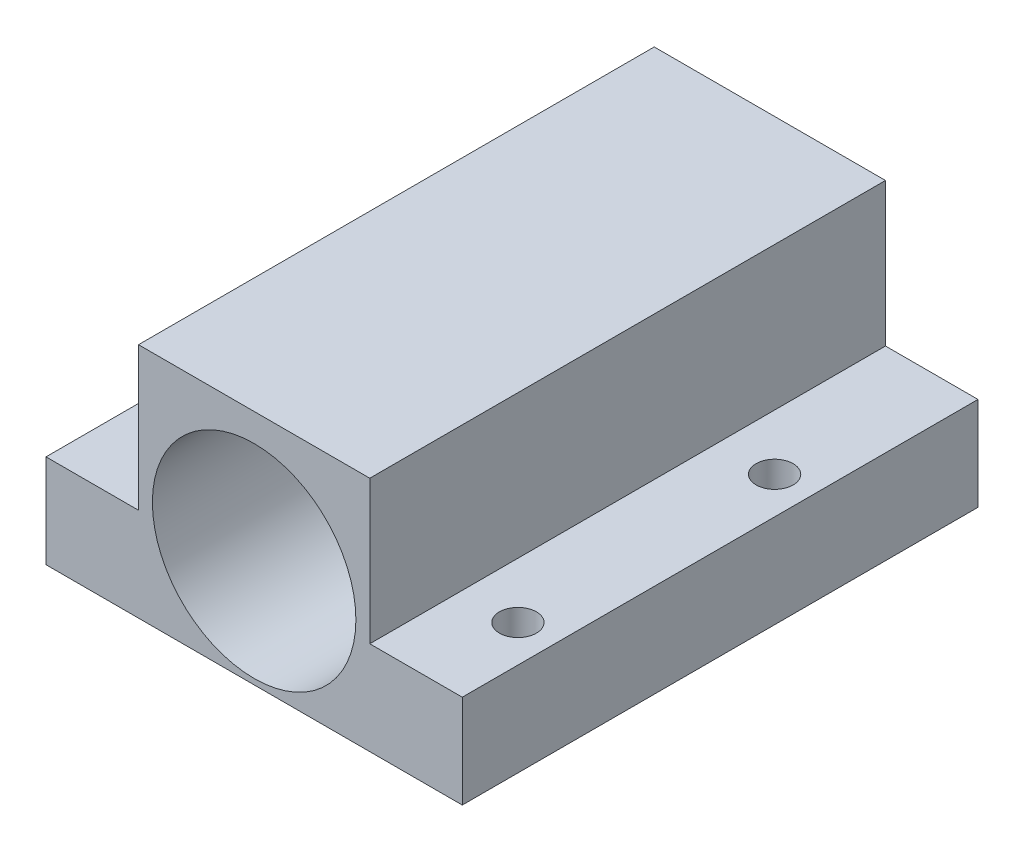
ISO-10303-21;
HEADER;
FILE_DESCRIPTION(('STEP AP214'),'2;1');
FILE_NAME('part.step','',(''),(''),'','','');
FILE_SCHEMA(('AUTOMOTIVE_DESIGN { 1 0 10303 214 1 1 1 1 }'));
ENDSEC;
DATA;
#1=APPLICATION_CONTEXT('core data for automotive mechanical design processes');
#2=APPLICATION_PROTOCOL_DEFINITION('international standard','automotive_design',2000,#1);
#3=PRODUCT_CONTEXT('',#1,'mechanical');
#4=PRODUCT('Part','Part','',(#3));
#5=PRODUCT_RELATED_PRODUCT_CATEGORY('part','',(#4));
#6=PRODUCT_DEFINITION_FORMATION('','',#4);
#7=PRODUCT_DEFINITION_CONTEXT('part definition',#1,'design');
#8=PRODUCT_DEFINITION('design','',#6,#7);
#9=PRODUCT_DEFINITION_SHAPE('','',#8);
#10=(LENGTH_UNIT() NAMED_UNIT(*) SI_UNIT(.MILLI.,.METRE.));
#11=(NAMED_UNIT(*) PLANE_ANGLE_UNIT() SI_UNIT($,.RADIAN.));
#12=(NAMED_UNIT(*) SI_UNIT($,.STERADIAN.) SOLID_ANGLE_UNIT());
#13=UNCERTAINTY_MEASURE_WITH_UNIT(LENGTH_MEASURE(1.E-05),#10,'distance_accuracy_value','');
#14=(GEOMETRIC_REPRESENTATION_CONTEXT(3) GLOBAL_UNCERTAINTY_ASSIGNED_CONTEXT((#13)) GLOBAL_UNIT_ASSIGNED_CONTEXT((#10,
#11,#12)) REPRESENTATION_CONTEXT('',''));
#15=CARTESIAN_POINT('',(0.,0.,0.));
#16=DIRECTION('',(0.,0.,1.));
#17=DIRECTION('',(1.,0.,0.));
#18=AXIS2_PLACEMENT_3D('',#15,#16,#17);
#19=CARTESIAN_POINT('',(-1.01488915650938,-5.09999999999996,-107.522193308764));
#20=DIRECTION('',(0.,0.,1.));
#21=DIRECTION('',(-0.999999999999997,0.,0.));
#22=AXIS2_PLACEMENT_3D('',#19,#20,#21);
#23=CYLINDRICAL_SURFACE('',#22,11.);
#24=CARTESIAN_POINT('',(-1.01488915650944,-5.09999999999996,-1.56125112837913E-13));
#25=DIRECTION('',(0.,0.,1.));
#26=DIRECTION('',(0.999999999999997,0.,0.));
#27=AXIS2_PLACEMENT_3D('',#24,#25,#26);
#28=CIRCLE('',#27,11.);
#29=CARTESIAN_POINT('',(9.98511084349053,-5.09999999999996,-1.56125112837916E-13));
#30=VERTEX_POINT('',#29);
#31=EDGE_CURVE('E146',#30,#30,#28,.T.);
#32=ORIENTED_EDGE('',*,*,#31,.T.);
#33=EDGE_LOOP('',(#32));
#34=FACE_BOUND('',#33,.T.);
#35=CARTESIAN_POINT('',(-1.01488915650938,-5.09999999999992,-55.75));
#36=DIRECTION('',(0.,0.,1.));
#37=DIRECTION('',(0.999999999999997,0.,0.));
#38=AXIS2_PLACEMENT_3D('',#35,#36,#37);
#39=CIRCLE('',#38,11.);
#40=CARTESIAN_POINT('',(9.98511084349059,-5.09999999999992,-55.75));
#41=VERTEX_POINT('',#40);
#42=EDGE_CURVE('E109',#41,#41,#39,.T.);
#43=ORIENTED_EDGE('',*,*,#42,.F.);
#44=EDGE_LOOP('',(#43));
#45=FACE_BOUND('',#44,.T.);
#46=ADVANCED_FACE('F37',(#34,#45),#23,.F.);
#47=CARTESIAN_POINT('',(0.,0.,0.));
#48=DIRECTION('',(0.,0.,-1.));
#49=DIRECTION('',(0.999999999999997,0.,0.));
#50=AXIS2_PLACEMENT_3D('',#47,#48,#49);
#51=PLANE('',#50);
#52=ORIENTED_EDGE('',*,*,#31,.F.);
#53=EDGE_LOOP('',(#52));
#54=FACE_BOUND('',#53,.T.);
#55=DIRECTION('',(0.,-0.999999999999997,0.));
#56=VECTOR('',#55,1.);
#57=CARTESIAN_POINT('',(11.4851108434906,0.,0.));
#58=LINE('',#57,#56);
#59=CARTESIAN_POINT('',(11.4851108434906,8.89999999999996,0.));
#60=VERTEX_POINT('',#59);
#61=CARTESIAN_POINT('',(11.4851108434906,-6.60000000000004,0.));
#62=VERTEX_POINT('',#61);
#63=EDGE_CURVE('E116',#60,#62,#58,.T.);
#64=ORIENTED_EDGE('',*,*,#63,.F.);
#65=DIRECTION('',(0.999999999999997,0.,0.));
#66=VECTOR('',#65,1.);
#67=CARTESIAN_POINT('',(0.,8.89999999999996,0.));
#68=LINE('',#67,#66);
#69=CARTESIAN_POINT('',(-13.5148891565094,8.89999999999996,-1.28369537222284E-13));
#70=VERTEX_POINT('',#69);
#71=EDGE_CURVE('E136',#70,#60,#68,.T.);
#72=ORIENTED_EDGE('',*,*,#71,.F.);
#73=DIRECTION('',(0.,-0.999999999999997,0.));
#74=VECTOR('',#73,1.);
#75=CARTESIAN_POINT('',(-13.5148891565094,0.,-1.28369537222284E-13));
#76=LINE('',#75,#74);
#77=CARTESIAN_POINT('',(-13.5148891565094,-6.59999999999996,-1.28369537222284E-13));
#78=VERTEX_POINT('',#77);
#79=EDGE_CURVE('E142',#70,#78,#76,.T.);
#80=ORIENTED_EDGE('',*,*,#79,.T.);
#81=DIRECTION('',(-0.999999999999997,0.,0.));
#82=VECTOR('',#81,1.);
#83=CARTESIAN_POINT('',(0.,-6.59999999999995,0.));
#84=LINE('',#83,#82);
#85=CARTESIAN_POINT('',(-23.5148891565094,-6.59999999999996,-1.56125112837913E-13));
#86=VERTEX_POINT('',#85);
#87=EDGE_CURVE('E153',#78,#86,#84,.T.);
#88=ORIENTED_EDGE('',*,*,#87,.T.);
#89=DIRECTION('',(0.,0.999999999999997,0.));
#90=VECTOR('',#89,1.);
#91=CARTESIAN_POINT('',(-23.5148891565094,0.,-1.56125112837913E-13));
#92=LINE('',#91,#90);
#93=CARTESIAN_POINT('',(-23.5148891565094,-16.7,-1.56125112837913E-13));
#94=VERTEX_POINT('',#93);
#95=EDGE_CURVE('E156',#94,#86,#92,.T.);
#96=ORIENTED_EDGE('',*,*,#95,.F.);
#97=DIRECTION('',(0.999999999999997,0.,0.));
#98=VECTOR('',#97,1.);
#99=CARTESIAN_POINT('',(0.,-16.6999999999999,0.));
#100=LINE('',#99,#98);
#101=CARTESIAN_POINT('',(21.4851108434906,-16.7,-1.66533453693773E-13));
#102=VERTEX_POINT('',#101);
#103=EDGE_CURVE('E159',#94,#102,#100,.T.);
#104=ORIENTED_EDGE('',*,*,#103,.T.);
#105=DIRECTION('',(0.,0.999999999999997,0.));
#106=VECTOR('',#105,1.);
#107=CARTESIAN_POINT('',(21.4851108434906,0.,-1.56125112837913E-13));
#108=LINE('',#107,#106);
#109=CARTESIAN_POINT('',(21.4851108434906,-6.59999999999996,-1.56125112837913E-13));
#110=VERTEX_POINT('',#109);
#111=EDGE_CURVE('E121',#102,#110,#108,.T.);
#112=ORIENTED_EDGE('',*,*,#111,.T.);
#113=DIRECTION('',(0.999999999999997,0.,0.));
#114=VECTOR('',#113,1.);
#115=CARTESIAN_POINT('',(0.,-6.59999999999996,0.));
#116=LINE('',#115,#114);
#117=EDGE_CURVE('E117',#62,#110,#116,.T.);
#118=ORIENTED_EDGE('',*,*,#117,.F.);
#119=EDGE_LOOP('',(#64,#72,#80,#88,#96,#104,#112,#118));
#120=FACE_BOUND('',#119,.T.);
#121=ADVANCED_FACE('F144',(#54,#120),#51,.F.);
#122=CARTESIAN_POINT('',(0.,-6.59999999999996,-107.522193308764));
#123=DIRECTION('',(0.,0.999999999999997,0.));
#124=DIRECTION('',(0.,0.,-1.));
#125=AXIS2_PLACEMENT_3D('',#122,#123,#124);
#126=PLANE('',#125);
#127=CARTESIAN_POINT('',(17.4999999999999,-6.59999999999995,-10.0000000000001));
#128=DIRECTION('',(0.,-0.999999999999997,0.));
#129=DIRECTION('',(-0.999999999999997,0.,0.));
#130=AXIS2_PLACEMENT_3D('',#127,#128,#129);
#131=CIRCLE('',#130,2.);
#132=CARTESIAN_POINT('',(15.4999999999999,-6.59999999999995,-10.0000000000001));
#133=VERTEX_POINT('',#132);
#134=EDGE_CURVE('E259',#133,#133,#131,.T.);
#135=ORIENTED_EDGE('',*,*,#134,.T.);
#136=EDGE_LOOP('',(#135));
#137=FACE_BOUND('',#136,.T.);
#138=CARTESIAN_POINT('',(17.4999999999999,-6.59999999999995,-37.75));
#139=DIRECTION('',(0.,-0.999999999999997,0.));
#140=DIRECTION('',(-0.999999999999997,0.,0.));
#141=AXIS2_PLACEMENT_3D('',#138,#139,#140);
#142=CIRCLE('',#141,2.);
#143=CARTESIAN_POINT('',(15.4999999999999,-6.59999999999995,-37.75));
#144=VERTEX_POINT('',#143);
#145=EDGE_CURVE('E254',#144,#144,#142,.T.);
#146=ORIENTED_EDGE('',*,*,#145,.T.);
#147=EDGE_LOOP('',(#146));
#148=FACE_BOUND('',#147,.T.);
#149=DIRECTION('',(0.,0.,1.));
#150=VECTOR('',#149,1.);
#151=CARTESIAN_POINT('',(11.4851108434906,-6.60000000000004,-107.522193308764));
#152=LINE('',#151,#150);
#153=CARTESIAN_POINT('',(11.4851108434906,-6.6,-55.7499999999998));
#154=VERTEX_POINT('',#153);
#155=EDGE_CURVE('E58',#154,#62,#152,.T.);
#156=ORIENTED_EDGE('',*,*,#155,.T.);
#157=ORIENTED_EDGE('',*,*,#117,.T.);
#158=DIRECTION('',(0.,0.,1.));
#159=VECTOR('',#158,1.);
#160=CARTESIAN_POINT('',(21.4851108434906,-6.59999999999997,-107.522193308764));
#161=LINE('',#160,#159);
#162=CARTESIAN_POINT('',(21.4851108434906,-6.6,-55.75));
#163=VERTEX_POINT('',#162);
#164=EDGE_CURVE('E112',#163,#110,#161,.T.);
#165=ORIENTED_EDGE('',*,*,#164,.F.);
#166=DIRECTION('',(0.999999999999997,0.,0.));
#167=VECTOR('',#166,1.);
#168=CARTESIAN_POINT('',(0.,-6.59999999999995,-55.7499999999998));
#169=LINE('',#168,#167);
#170=EDGE_CURVE('E11',#154,#163,#169,.T.);
#171=ORIENTED_EDGE('',*,*,#170,.F.);
#172=EDGE_LOOP('',(#156,#157,#165,#171));
#173=FACE_BOUND('',#172,.T.);
#174=ADVANCED_FACE('F111',(#137,#148,#173),#126,.T.);
#175=CARTESIAN_POINT('',(21.4851108434906,0.,-107.522193308764));
#176=DIRECTION('',(-0.999999999999997,0.,0.));
#177=DIRECTION('',(0.,0.,-1.));
#178=AXIS2_PLACEMENT_3D('',#175,#176,#177);
#179=PLANE('',#178);
#180=DIRECTION('',(0.,0.999999999999997,0.));
#181=VECTOR('',#180,1.);
#182=CARTESIAN_POINT('',(21.4851108434906,0.,-55.75));
#183=LINE('',#182,#181);
#184=CARTESIAN_POINT('',(21.4851108434906,-16.7,-55.75));
#185=VERTEX_POINT('',#184);
#186=EDGE_CURVE('E51',#185,#163,#183,.T.);
#187=ORIENTED_EDGE('',*,*,#186,.T.);
#188=ORIENTED_EDGE('',*,*,#164,.T.);
#189=ORIENTED_EDGE('',*,*,#111,.F.);
#190=DIRECTION('',(0.,0.,1.));
#191=VECTOR('',#190,1.);
#192=CARTESIAN_POINT('',(21.4851108434906,-16.7,-107.522193308764));
#193=LINE('',#192,#191);
#194=EDGE_CURVE('E119',#185,#102,#193,.T.);
#195=ORIENTED_EDGE('',*,*,#194,.F.);
#196=EDGE_LOOP('',(#187,#188,#189,#195));
#197=FACE_BOUND('',#196,.T.);
#198=ADVANCED_FACE('F164',(#197),#179,.F.);
#199=CARTESIAN_POINT('',(0.,-16.7,-107.522193308764));
#200=DIRECTION('',(0.,0.999999999999997,0.));
#201=DIRECTION('',(0.,0.,-1.));
#202=AXIS2_PLACEMENT_3D('',#199,#200,#201);
#203=PLANE('',#202);
#204=CARTESIAN_POINT('',(-17.5000000000001,-16.7,-37.75));
#205=DIRECTION('',(0.,-0.999999999999997,0.));
#206=DIRECTION('',(-0.999999999999997,0.,0.));
#207=AXIS2_PLACEMENT_3D('',#204,#205,#206);
#208=CIRCLE('',#207,2.);
#209=CARTESIAN_POINT('',(-19.5000000000001,-16.7,-37.75));
#210=VERTEX_POINT('',#209);
#211=EDGE_CURVE('E266',#210,#210,#208,.T.);
#212=ORIENTED_EDGE('',*,*,#211,.F.);
#213=EDGE_LOOP('',(#212));
#214=FACE_BOUND('',#213,.T.);
#215=CARTESIAN_POINT('',(17.4999999999999,-16.7,-10.0000000000001));
#216=DIRECTION('',(0.,-0.999999999999997,0.));
#217=DIRECTION('',(-0.999999999999997,0.,0.));
#218=AXIS2_PLACEMENT_3D('',#215,#216,#217);
#219=CIRCLE('',#218,2.);
#220=CARTESIAN_POINT('',(15.4999999999999,-16.7,-10.0000000000001));
#221=VERTEX_POINT('',#220);
#222=EDGE_CURVE('E256',#221,#221,#219,.T.);
#223=ORIENTED_EDGE('',*,*,#222,.F.);
#224=EDGE_LOOP('',(#223));
#225=FACE_BOUND('',#224,.T.);
#226=CARTESIAN_POINT('',(17.4999999999999,-16.7,-37.75));
#227=DIRECTION('',(0.,-0.999999999999997,0.));
#228=DIRECTION('',(-0.999999999999997,0.,0.));
#229=AXIS2_PLACEMENT_3D('',#226,#227,#228);
#230=CIRCLE('',#229,2.);
#231=CARTESIAN_POINT('',(15.4999999999999,-16.7,-37.75));
#232=VERTEX_POINT('',#231);
#233=EDGE_CURVE('E251',#232,#232,#230,.T.);
#234=ORIENTED_EDGE('',*,*,#233,.F.);
#235=EDGE_LOOP('',(#234));
#236=FACE_BOUND('',#235,.T.);
#237=CARTESIAN_POINT('',(-17.5,-16.7,-10.));
#238=DIRECTION('',(0.,-0.999999999999997,0.));
#239=DIRECTION('',(-0.999999999999997,0.,0.));
#240=AXIS2_PLACEMENT_3D('',#237,#238,#239);
#241=CIRCLE('',#240,2.);
#242=CARTESIAN_POINT('',(-19.5,-16.7,-10.));
#243=VERTEX_POINT('',#242);
#244=EDGE_CURVE('E169',#243,#243,#241,.T.);
#245=ORIENTED_EDGE('',*,*,#244,.F.);
#246=EDGE_LOOP('',(#245));
#247=FACE_BOUND('',#246,.T.);
#248=DIRECTION('',(0.999999999999997,0.,0.));
#249=VECTOR('',#248,1.);
#250=CARTESIAN_POINT('',(0.,-16.6999999999999,-55.7499999999998));
#251=LINE('',#250,#249);
#252=CARTESIAN_POINT('',(-23.5148891565094,-16.6999999999999,-55.75));
#253=VERTEX_POINT('',#252);
#254=EDGE_CURVE('E168',#253,#185,#251,.T.);
#255=ORIENTED_EDGE('',*,*,#254,.T.);
#256=ORIENTED_EDGE('',*,*,#194,.T.);
#257=ORIENTED_EDGE('',*,*,#103,.F.);
#258=DIRECTION('',(0.,0.,1.));
#259=VECTOR('',#258,1.);
#260=CARTESIAN_POINT('',(-23.5148891565094,-16.7,-107.522193308764));
#261=LINE('',#260,#259);
#262=EDGE_CURVE('E126',#253,#94,#261,.T.);
#263=ORIENTED_EDGE('',*,*,#262,.F.);
#264=EDGE_LOOP('',(#255,#256,#257,#263));
#265=FACE_BOUND('',#264,.T.);
#266=ADVANCED_FACE('F205',(#214,#225,#236,#247,#265),#203,.F.);
#267=CARTESIAN_POINT('',(-23.5148891565094,0.,-107.522193308764));
#268=DIRECTION('',(-0.999999999999997,0.,0.));
#269=DIRECTION('',(0.,0.,-1.));
#270=AXIS2_PLACEMENT_3D('',#267,#268,#269);
#271=PLANE('',#270);
#272=ORIENTED_EDGE('',*,*,#262,.T.);
#273=ORIENTED_EDGE('',*,*,#95,.T.);
#274=DIRECTION('',(0.,0.,1.));
#275=VECTOR('',#274,1.);
#276=CARTESIAN_POINT('',(-23.5148891565094,-6.60000000000004,-107.522193308764));
#277=LINE('',#276,#275);
#278=CARTESIAN_POINT('',(-23.5148891565093,-6.6,-55.75));
#279=VERTEX_POINT('',#278);
#280=EDGE_CURVE('E128',#279,#86,#277,.T.);
#281=ORIENTED_EDGE('',*,*,#280,.F.);
#282=DIRECTION('',(0.,0.999999999999997,0.));
#283=VECTOR('',#282,1.);
#284=CARTESIAN_POINT('',(-23.5148891565088,0.,-55.75));
#285=LINE('',#284,#283);
#286=EDGE_CURVE('E171',#253,#279,#285,.T.);
#287=ORIENTED_EDGE('',*,*,#286,.F.);
#288=EDGE_LOOP('',(#272,#273,#281,#287));
#289=FACE_BOUND('',#288,.T.);
#290=ADVANCED_FACE('F208',(#289),#271,.T.);
#291=CARTESIAN_POINT('',(0.,-6.59999999999996,-107.522193308764));
#292=DIRECTION('',(0.,-0.999999999999997,0.));
#293=DIRECTION('',(0.999999999999997,0.,0.));
#294=AXIS2_PLACEMENT_3D('',#291,#292,#293);
#295=PLANE('',#294);
#296=CARTESIAN_POINT('',(-17.5000000000001,-6.59999999999995,-37.75));
#297=DIRECTION('',(0.,-0.999999999999997,0.));
#298=DIRECTION('',(-0.999999999999997,0.,0.));
#299=AXIS2_PLACEMENT_3D('',#296,#297,#298);
#300=CIRCLE('',#299,2.);
#301=CARTESIAN_POINT('',(-19.5000000000001,-6.59999999999995,-37.75));
#302=VERTEX_POINT('',#301);
#303=EDGE_CURVE('E263',#302,#302,#300,.T.);
#304=ORIENTED_EDGE('',*,*,#303,.T.);
#305=EDGE_LOOP('',(#304));
#306=FACE_BOUND('',#305,.T.);
#307=CARTESIAN_POINT('',(-17.4999999999993,-6.59999999999996,-10.));
#308=DIRECTION('',(0.,-0.999999999999997,0.));
#309=DIRECTION('',(-0.999999999999997,0.,0.));
#310=AXIS2_PLACEMENT_3D('',#307,#308,#309);
#311=CIRCLE('',#310,2.);
#312=CARTESIAN_POINT('',(-19.5,-6.59999999999996,-10.));
#313=VERTEX_POINT('',#312);
#314=EDGE_CURVE('E174',#313,#313,#311,.T.);
#315=ORIENTED_EDGE('',*,*,#314,.T.);
#316=EDGE_LOOP('',(#315));
#317=FACE_BOUND('',#316,.T.);
#318=DIRECTION('',(-0.999999999999997,0.,0.));
#319=VECTOR('',#318,1.);
#320=CARTESIAN_POINT('',(0.,-6.59999999999995,-55.7499999999998));
#321=LINE('',#320,#319);
#322=CARTESIAN_POINT('',(-13.5148891565094,-6.59999999999999,-55.75));
#323=VERTEX_POINT('',#322);
#324=EDGE_CURVE('E179',#323,#279,#321,.T.);
#325=ORIENTED_EDGE('',*,*,#324,.T.);
#326=ORIENTED_EDGE('',*,*,#280,.T.);
#327=ORIENTED_EDGE('',*,*,#87,.F.);
#328=DIRECTION('',(0.,0.,1.));
#329=VECTOR('',#328,1.);
#330=CARTESIAN_POINT('',(-13.5148891565094,-6.59999999999996,-107.522193308764));
#331=LINE('',#330,#329);
#332=EDGE_CURVE('E130',#323,#78,#331,.T.);
#333=ORIENTED_EDGE('',*,*,#332,.F.);
#334=EDGE_LOOP('',(#325,#326,#327,#333));
#335=FACE_BOUND('',#334,.T.);
#336=ADVANCED_FACE('F212',(#306,#317,#335),#295,.F.);
#337=CARTESIAN_POINT('',(-13.5148891565094,0.,-107.522193308764));
#338=DIRECTION('',(0.999999999999997,0.,0.));
#339=DIRECTION('',(0.,0.999999999999997,0.));
#340=AXIS2_PLACEMENT_3D('',#337,#338,#339);
#341=PLANE('',#340);
#342=DIRECTION('',(0.,-0.999999999999997,0.));
#343=VECTOR('',#342,1.);
#344=CARTESIAN_POINT('',(-13.5148891565088,0.,-55.75));
#345=LINE('',#344,#343);
#346=CARTESIAN_POINT('',(-13.5148891565088,8.89999999999996,-55.75));
#347=VERTEX_POINT('',#346);
#348=EDGE_CURVE('E181',#347,#323,#345,.T.);
#349=ORIENTED_EDGE('',*,*,#348,.T.);
#350=ORIENTED_EDGE('',*,*,#332,.T.);
#351=ORIENTED_EDGE('',*,*,#79,.F.);
#352=DIRECTION('',(0.,0.,1.));
#353=VECTOR('',#352,1.);
#354=CARTESIAN_POINT('',(-13.5148891565094,8.89999999999996,-107.522193308764));
#355=LINE('',#354,#353);
#356=EDGE_CURVE('E132',#347,#70,#355,.T.);
#357=ORIENTED_EDGE('',*,*,#356,.F.);
#358=EDGE_LOOP('',(#349,#350,#351,#357));
#359=FACE_BOUND('',#358,.T.);
#360=ADVANCED_FACE('F216',(#359),#341,.F.);
#361=CARTESIAN_POINT('',(0.,8.89999999999994,-107.522193308764));
#362=DIRECTION('',(0.,0.999999999999997,0.));
#363=DIRECTION('',(0.,0.,-1.));
#364=AXIS2_PLACEMENT_3D('',#361,#362,#363);
#365=PLANE('',#364);
#366=ORIENTED_EDGE('',*,*,#356,.T.);
#367=ORIENTED_EDGE('',*,*,#71,.T.);
#368=DIRECTION('',(0.,0.,1.));
#369=VECTOR('',#368,1.);
#370=CARTESIAN_POINT('',(11.4851108434906,8.89999999999996,-107.522193308764));
#371=LINE('',#370,#369);
#372=CARTESIAN_POINT('',(11.4851108434912,8.89999999999995,-55.7499999999998));
#373=VERTEX_POINT('',#372);
#374=EDGE_CURVE('E44',#373,#60,#371,.T.);
#375=ORIENTED_EDGE('',*,*,#374,.F.);
#376=DIRECTION('',(0.999999999999997,0.,0.));
#377=VECTOR('',#376,1.);
#378=CARTESIAN_POINT('',(6.10622663543836E-13,8.89999999999992,-55.7499999999998));
#379=LINE('',#378,#377);
#380=EDGE_CURVE('E106',#347,#373,#379,.T.);
#381=ORIENTED_EDGE('',*,*,#380,.F.);
#382=EDGE_LOOP('',(#366,#367,#375,#381));
#383=FACE_BOUND('',#382,.T.);
#384=ADVANCED_FACE('F137',(#383),#365,.T.);
#385=CARTESIAN_POINT('',(11.4851108434906,0.,-107.522193308764));
#386=DIRECTION('',(0.999999999999997,0.,0.));
#387=DIRECTION('',(0.,0.999999999999997,0.));
#388=AXIS2_PLACEMENT_3D('',#385,#386,#387);
#389=PLANE('',#388);
#390=ORIENTED_EDGE('',*,*,#374,.T.);
#391=ORIENTED_EDGE('',*,*,#63,.T.);
#392=ORIENTED_EDGE('',*,*,#155,.F.);
#393=DIRECTION('',(0.,-0.999999999999997,0.));
#394=VECTOR('',#393,1.);
#395=CARTESIAN_POINT('',(11.4851108434906,0.,-55.7499999999998));
#396=LINE('',#395,#394);
#397=EDGE_CURVE('E102',#373,#154,#396,.T.);
#398=ORIENTED_EDGE('',*,*,#397,.F.);
#399=EDGE_LOOP('',(#390,#391,#392,#398));
#400=FACE_BOUND('',#399,.T.);
#401=ADVANCED_FACE('F114',(#400),#389,.T.);
#402=CARTESIAN_POINT('',(284.590151880347,-28.4999999999999,-55.7499999999997));
#403=DIRECTION('',(0.,0.,-1.));
#404=DIRECTION('',(-0.999999999999997,0.,0.));
#405=AXIS2_PLACEMENT_3D('',#402,#403,#404);
#406=PLANE('',#405);
#407=ORIENTED_EDGE('',*,*,#42,.T.);
#408=EDGE_LOOP('',(#407));
#409=FACE_BOUND('',#408,.T.);
#410=ORIENTED_EDGE('',*,*,#397,.T.);
#411=ORIENTED_EDGE('',*,*,#170,.T.);
#412=ORIENTED_EDGE('',*,*,#186,.F.);
#413=ORIENTED_EDGE('',*,*,#254,.F.);
#414=ORIENTED_EDGE('',*,*,#286,.T.);
#415=ORIENTED_EDGE('',*,*,#324,.F.);
#416=ORIENTED_EDGE('',*,*,#348,.F.);
#417=ORIENTED_EDGE('',*,*,#380,.T.);
#418=EDGE_LOOP('',(#410,#411,#412,#413,#414,#415,#416,#417));
#419=FACE_BOUND('',#418,.T.);
#420=ADVANCED_FACE('F103',(#409,#419),#406,.T.);
#421=CARTESIAN_POINT('',(-17.5,-16.7,-10.));
#422=DIRECTION('',(0.,0.999999999999997,0.));
#423=DIRECTION('',(-0.999999999999997,0.,0.));
#424=AXIS2_PLACEMENT_3D('',#421,#422,#423);
#425=CYLINDRICAL_SURFACE('',#424,2.);
#426=CARTESIAN_POINT('',(-19.5,-16.7,-10.));
#427=CARTESIAN_POINT('',(-19.5,-16.5947916666666,-10.));
#428=CARTESIAN_POINT('',(-19.5,-16.4895833333333,-10.));
#429=CARTESIAN_POINT('',(-19.5,-16.2791666666666,-10.));
#430=CARTESIAN_POINT('',(-19.5,-16.1739583333333,-10.));
#431=CARTESIAN_POINT('',(-19.5,-15.9635416666666,-10.));
#432=CARTESIAN_POINT('',(-19.5,-15.8583333333333,-10.));
#433=CARTESIAN_POINT('',(-19.5,-15.6479166666666,-10.));
#434=CARTESIAN_POINT('',(-19.5,-15.5427083333333,-10.));
#435=CARTESIAN_POINT('',(-19.5,-15.3322916666666,-10.));
#436=CARTESIAN_POINT('',(-19.5,-15.2270833333333,-10.));
#437=CARTESIAN_POINT('',(-19.5,-15.0166666666666,-10.));
#438=CARTESIAN_POINT('',(-19.5,-14.9114583333333,-10.));
#439=CARTESIAN_POINT('',(-19.5,-14.7010416666666,-10.));
#440=CARTESIAN_POINT('',(-19.5,-14.5958333333333,-10.));
#441=CARTESIAN_POINT('',(-19.5,-14.3854166666666,-10.));
#442=CARTESIAN_POINT('',(-19.5,-14.2802083333333,-10.));
#443=CARTESIAN_POINT('',(-19.5,-14.0697916666666,-10.));
#444=CARTESIAN_POINT('',(-19.5,-13.9645833333333,-10.));
#445=CARTESIAN_POINT('',(-19.5,-13.7541666666666,-10.));
#446=CARTESIAN_POINT('',(-19.5,-13.6489583333333,-10.));
#447=CARTESIAN_POINT('',(-19.5,-13.4385416666666,-10.));
#448=CARTESIAN_POINT('',(-19.5,-13.3333333333333,-10.));
#449=CARTESIAN_POINT('',(-19.5,-13.1229166666666,-10.));
#450=CARTESIAN_POINT('',(-19.5,-13.0177083333333,-10.));
#451=CARTESIAN_POINT('',(-19.5,-12.8072916666666,-10.));
#452=CARTESIAN_POINT('',(-19.5,-12.7020833333333,-10.));
#453=CARTESIAN_POINT('',(-19.5,-12.4916666666666,-10.));
#454=CARTESIAN_POINT('',(-19.5,-12.3864583333333,-10.));
#455=CARTESIAN_POINT('',(-19.5,-12.1760416666666,-10.));
#456=CARTESIAN_POINT('',(-19.5,-12.0708333333333,-10.));
#457=CARTESIAN_POINT('',(-19.5,-11.8604166666666,-10.));
#458=CARTESIAN_POINT('',(-19.5,-11.7552083333333,-10.));
#459=CARTESIAN_POINT('',(-19.5,-11.5447916666666,-10.));
#460=CARTESIAN_POINT('',(-19.5,-11.4395833333333,-10.));
#461=CARTESIAN_POINT('',(-19.5,-11.2291666666666,-10.));
#462=CARTESIAN_POINT('',(-19.5,-11.1239583333333,-10.));
#463=CARTESIAN_POINT('',(-19.5,-10.9135416666666,-10.));
#464=CARTESIAN_POINT('',(-19.5,-10.8083333333333,-10.));
#465=CARTESIAN_POINT('',(-19.5,-10.5979166666666,-10.));
#466=CARTESIAN_POINT('',(-19.5,-10.4927083333333,-10.));
#467=CARTESIAN_POINT('',(-19.5,-10.2822916666666,-10.));
#468=CARTESIAN_POINT('',(-19.5,-10.1770833333333,-10.));
#469=CARTESIAN_POINT('',(-19.5,-9.96666666666663,-10.));
#470=CARTESIAN_POINT('',(-19.5,-9.86145833333329,-10.));
#471=CARTESIAN_POINT('',(-19.5,-9.65104166666663,-10.));
#472=CARTESIAN_POINT('',(-19.5,-9.54583333333329,-10.));
#473=CARTESIAN_POINT('',(-19.5,-9.33541666666663,-10.));
#474=CARTESIAN_POINT('',(-19.5,-9.23020833333329,-10.));
#475=CARTESIAN_POINT('',(-19.5,-9.01979166666663,-10.));
#476=CARTESIAN_POINT('',(-19.5,-8.91458333333329,-10.));
#477=CARTESIAN_POINT('',(-19.5,-8.70416666666662,-10.));
#478=CARTESIAN_POINT('',(-19.5,-8.59895833333329,-10.));
#479=CARTESIAN_POINT('',(-19.5,-8.38854166666663,-10.));
#480=CARTESIAN_POINT('',(-19.5,-8.28333333333329,-10.));
#481=CARTESIAN_POINT('',(-19.5,-8.07291666666663,-10.));
#482=CARTESIAN_POINT('',(-19.5,-7.96770833333329,-10.));
#483=CARTESIAN_POINT('',(-19.5,-7.75729166666663,-10.));
#484=CARTESIAN_POINT('',(-19.5,-7.65208333333329,-10.));
#485=CARTESIAN_POINT('',(-19.5,-7.44166666666663,-10.));
#486=CARTESIAN_POINT('',(-19.5,-7.33645833333329,-10.));
#487=CARTESIAN_POINT('',(-19.5,-7.12604166666663,-10.));
#488=CARTESIAN_POINT('',(-19.5,-7.02083333333329,-10.));
#489=CARTESIAN_POINT('',(-19.5,-6.81041666666663,-10.));
#490=CARTESIAN_POINT('',(-19.5,-6.70520833333329,-10.));
#491=CARTESIAN_POINT('',(-19.5,-6.59999999999996,-10.));
#492=B_SPLINE_CURVE_WITH_KNOTS('',3,(#426,#427,#428,#429,#430,#431,#432,#433,#434,#435,#436,
#437,#438,#439,#440,#441,#442,#443,#444,#445,#446,#447,#448,#449,#450,#451,#452,#453,#454,#455,
#456,#457,#458,#459,#460,#461,#462,#463,#464,#465,#466,#467,#468,#469,#470,#471,#472,#473,#474,
#475,#476,#477,#478,#479,#480,#481,#482,#483,#484,#485,#486,#487,#488,#489,#490,#491),
.UNSPECIFIED.,.F.,.F.,(4,2,2,2,2,2,2,2,2,2,2,2,2,2,2,2,2,2,2,2,2,2,2,2,2,2,2,2,2,2,2,2,4),(0.,
0.315625,0.63125,0.946875,1.2625,1.578125,1.89375,2.209375,2.525,2.840625,3.15625,3.471875,
3.7875,4.103125,4.41875,4.734375,5.05,5.365625,5.68125,5.996875,6.3125,6.628125,6.94375,
7.259375,7.575,7.890625,8.20625,8.521875,8.8375,9.153125,9.46875,9.784375,10.1),.UNSPECIFIED.);
#493=EDGE_CURVE('BSEAM226',#243,#313,#492,.T.);
#494=ORIENTED_EDGE('',*,*,#244,.T.);
#495=ORIENTED_EDGE('',*,*,#314,.F.);
#496=ORIENTED_EDGE('',*,*,#493,.T.);
#497=ORIENTED_EDGE('',*,*,#493,.F.);
#498=EDGE_LOOP('',(#494,#496,#495,#497));
#499=FACE_BOUND('',#498,.T.);
#500=ADVANCED_FACE('F226',(#499),#425,.F.);
#501=CARTESIAN_POINT('',(-17.5000000000001,-16.7,-37.75));
#502=DIRECTION('',(0.,0.999999999999997,0.));
#503=DIRECTION('',(-0.999999999999997,0.,0.));
#504=AXIS2_PLACEMENT_3D('',#501,#502,#503);
#505=CYLINDRICAL_SURFACE('',#504,2.);
#506=CARTESIAN_POINT('',(-19.5000000000001,-16.7,-37.75));
#507=CARTESIAN_POINT('',(-19.5000000000001,-16.5947916666666,-37.75));
#508=CARTESIAN_POINT('',(-19.5000000000001,-16.4895833333333,-37.75));
#509=CARTESIAN_POINT('',(-19.5000000000001,-16.2791666666666,-37.75));
#510=CARTESIAN_POINT('',(-19.5000000000001,-16.1739583333333,-37.75));
#511=CARTESIAN_POINT('',(-19.5000000000001,-15.9635416666666,-37.75));
#512=CARTESIAN_POINT('',(-19.5000000000001,-15.8583333333333,-37.75));
#513=CARTESIAN_POINT('',(-19.5000000000001,-15.6479166666666,-37.75));
#514=CARTESIAN_POINT('',(-19.5000000000001,-15.5427083333333,-37.75));
#515=CARTESIAN_POINT('',(-19.5000000000001,-15.3322916666666,-37.75));
#516=CARTESIAN_POINT('',(-19.5000000000001,-15.2270833333333,-37.75));
#517=CARTESIAN_POINT('',(-19.5000000000001,-15.0166666666666,-37.75));
#518=CARTESIAN_POINT('',(-19.5000000000001,-14.9114583333333,-37.75));
#519=CARTESIAN_POINT('',(-19.5000000000001,-14.7010416666666,-37.75));
#520=CARTESIAN_POINT('',(-19.5000000000001,-14.5958333333333,-37.75));
#521=CARTESIAN_POINT('',(-19.5000000000001,-14.3854166666666,-37.75));
#522=CARTESIAN_POINT('',(-19.5000000000001,-14.2802083333333,-37.75));
#523=CARTESIAN_POINT('',(-19.5000000000001,-14.0697916666666,-37.75));
#524=CARTESIAN_POINT('',(-19.5000000000001,-13.9645833333333,-37.75));
#525=CARTESIAN_POINT('',(-19.5000000000001,-13.7541666666666,-37.75));
#526=CARTESIAN_POINT('',(-19.5000000000001,-13.6489583333333,-37.75));
#527=CARTESIAN_POINT('',(-19.5000000000001,-13.4385416666666,-37.75));
#528=CARTESIAN_POINT('',(-19.5000000000001,-13.3333333333333,-37.75));
#529=CARTESIAN_POINT('',(-19.5000000000001,-13.1229166666666,-37.75));
#530=CARTESIAN_POINT('',(-19.5000000000001,-13.0177083333333,-37.75));
#531=CARTESIAN_POINT('',(-19.5000000000001,-12.8072916666666,-37.75));
#532=CARTESIAN_POINT('',(-19.5000000000001,-12.7020833333333,-37.75));
#533=CARTESIAN_POINT('',(-19.5000000000001,-12.4916666666666,-37.75));
#534=CARTESIAN_POINT('',(-19.5000000000001,-12.3864583333333,-37.75));
#535=CARTESIAN_POINT('',(-19.5000000000001,-12.1760416666666,-37.75));
#536=CARTESIAN_POINT('',(-19.5000000000001,-12.0708333333333,-37.75));
#537=CARTESIAN_POINT('',(-19.5000000000001,-11.8604166666666,-37.75));
#538=CARTESIAN_POINT('',(-19.5000000000001,-11.7552083333333,-37.75));
#539=CARTESIAN_POINT('',(-19.5000000000001,-11.5447916666666,-37.75));
#540=CARTESIAN_POINT('',(-19.5000000000001,-11.4395833333333,-37.75));
#541=CARTESIAN_POINT('',(-19.5000000000001,-11.2291666666666,-37.75));
#542=CARTESIAN_POINT('',(-19.5000000000001,-11.1239583333333,-37.75));
#543=CARTESIAN_POINT('',(-19.5000000000001,-10.9135416666666,-37.75));
#544=CARTESIAN_POINT('',(-19.5000000000001,-10.8083333333333,-37.75));
#545=CARTESIAN_POINT('',(-19.5000000000001,-10.5979166666666,-37.75));
#546=CARTESIAN_POINT('',(-19.5000000000001,-10.4927083333333,-37.75));
#547=CARTESIAN_POINT('',(-19.5000000000001,-10.2822916666666,-37.75));
#548=CARTESIAN_POINT('',(-19.5000000000001,-10.1770833333333,-37.75));
#549=CARTESIAN_POINT('',(-19.5000000000001,-9.96666666666662,-37.75));
#550=CARTESIAN_POINT('',(-19.5000000000001,-9.86145833333328,-37.75));
#551=CARTESIAN_POINT('',(-19.5000000000001,-9.65104166666661,-37.75));
#552=CARTESIAN_POINT('',(-19.5000000000001,-9.54583333333328,-37.75));
#553=CARTESIAN_POINT('',(-19.5000000000001,-9.33541666666662,-37.75));
#554=CARTESIAN_POINT('',(-19.5000000000001,-9.23020833333328,-37.75));
#555=CARTESIAN_POINT('',(-19.5000000000001,-9.01979166666661,-37.75));
#556=CARTESIAN_POINT('',(-19.5000000000001,-8.91458333333328,-37.75));
#557=CARTESIAN_POINT('',(-19.5000000000001,-8.70416666666662,-37.75));
#558=CARTESIAN_POINT('',(-19.5000000000001,-8.59895833333328,-37.75));
#559=CARTESIAN_POINT('',(-19.5000000000001,-8.38854166666662,-37.75));
#560=CARTESIAN_POINT('',(-19.5000000000001,-8.28333333333328,-37.75));
#561=CARTESIAN_POINT('',(-19.5000000000001,-8.07291666666661,-37.75));
#562=CARTESIAN_POINT('',(-19.5000000000001,-7.96770833333328,-37.75));
#563=CARTESIAN_POINT('',(-19.5000000000001,-7.75729166666661,-37.75));
#564=CARTESIAN_POINT('',(-19.5000000000001,-7.65208333333328,-37.75));
#565=CARTESIAN_POINT('',(-19.5000000000001,-7.44166666666661,-37.75));
#566=CARTESIAN_POINT('',(-19.5000000000001,-7.33645833333328,-37.75));
#567=CARTESIAN_POINT('',(-19.5000000000001,-7.12604166666661,-37.75));
#568=CARTESIAN_POINT('',(-19.5000000000001,-7.02083333333328,-37.75));
#569=CARTESIAN_POINT('',(-19.5000000000001,-6.81041666666661,-37.75));
#570=CARTESIAN_POINT('',(-19.5000000000001,-6.70520833333328,-37.75));
#571=CARTESIAN_POINT('',(-19.5000000000001,-6.59999999999995,-37.75));
#572=B_SPLINE_CURVE_WITH_KNOTS('',3,(#506,#507,#508,#509,#510,#511,#512,#513,#514,#515,#516,
#517,#518,#519,#520,#521,#522,#523,#524,#525,#526,#527,#528,#529,#530,#531,#532,#533,#534,#535,
#536,#537,#538,#539,#540,#541,#542,#543,#544,#545,#546,#547,#548,#549,#550,#551,#552,#553,#554,
#555,#556,#557,#558,#559,#560,#561,#562,#563,#564,#565,#566,#567,#568,#569,#570,#571),
.UNSPECIFIED.,.F.,.F.,(4,2,2,2,2,2,2,2,2,2,2,2,2,2,2,2,2,2,2,2,2,2,2,2,2,2,2,2,2,2,2,2,4),(0.,
0.315625,0.63125,0.946875,1.2625,1.578125,1.89375,2.209375,2.525,2.840625,3.15625,3.471875,
3.7875,4.103125,4.41875,4.734375,5.05000000000001,5.36562500000001,5.68125000000001,
5.99687500000001,6.31250000000001,6.62812500000001,6.94375000000001,7.25937500000001,
7.57500000000001,7.89062500000001,8.20625000000001,8.52187500000001,8.83750000000001,
9.15312500000001,9.46875000000001,9.78437500000001,10.1),.UNSPECIFIED.);
#573=EDGE_CURVE('BSEAM230',#210,#302,#572,.T.);
#574=ORIENTED_EDGE('',*,*,#211,.T.);
#575=ORIENTED_EDGE('',*,*,#303,.F.);
#576=ORIENTED_EDGE('',*,*,#573,.T.);
#577=ORIENTED_EDGE('',*,*,#573,.F.);
#578=EDGE_LOOP('',(#574,#576,#575,#577));
#579=FACE_BOUND('',#578,.T.);
#580=ADVANCED_FACE('F230',(#579),#505,.F.);
#581=CARTESIAN_POINT('',(17.4999999999999,-16.7,-37.75));
#582=DIRECTION('',(0.,0.999999999999997,0.));
#583=DIRECTION('',(-0.999999999999997,0.,0.));
#584=AXIS2_PLACEMENT_3D('',#581,#582,#583);
#585=CYLINDRICAL_SURFACE('',#584,2.);
#586=CARTESIAN_POINT('',(15.4999999999999,-16.7,-37.75));
#587=CARTESIAN_POINT('',(15.4999999999999,-16.5947916666666,-37.75));
#588=CARTESIAN_POINT('',(15.4999999999999,-16.4895833333333,-37.75));
#589=CARTESIAN_POINT('',(15.4999999999999,-16.2791666666666,-37.75));
#590=CARTESIAN_POINT('',(15.4999999999999,-16.1739583333333,-37.75));
#591=CARTESIAN_POINT('',(15.4999999999999,-15.9635416666666,-37.75));
#592=CARTESIAN_POINT('',(15.4999999999999,-15.8583333333333,-37.75));
#593=CARTESIAN_POINT('',(15.4999999999999,-15.6479166666666,-37.75));
#594=CARTESIAN_POINT('',(15.4999999999999,-15.5427083333333,-37.75));
#595=CARTESIAN_POINT('',(15.4999999999999,-15.3322916666666,-37.75));
#596=CARTESIAN_POINT('',(15.4999999999999,-15.2270833333333,-37.75));
#597=CARTESIAN_POINT('',(15.4999999999999,-15.0166666666666,-37.75));
#598=CARTESIAN_POINT('',(15.4999999999999,-14.9114583333333,-37.75));
#599=CARTESIAN_POINT('',(15.4999999999999,-14.7010416666666,-37.75));
#600=CARTESIAN_POINT('',(15.4999999999999,-14.5958333333333,-37.75));
#601=CARTESIAN_POINT('',(15.4999999999999,-14.3854166666666,-37.75));
#602=CARTESIAN_POINT('',(15.4999999999999,-14.2802083333333,-37.75));
#603=CARTESIAN_POINT('',(15.4999999999999,-14.0697916666666,-37.75));
#604=CARTESIAN_POINT('',(15.4999999999999,-13.9645833333333,-37.75));
#605=CARTESIAN_POINT('',(15.4999999999999,-13.7541666666666,-37.75));
#606=CARTESIAN_POINT('',(15.4999999999999,-13.6489583333333,-37.75));
#607=CARTESIAN_POINT('',(15.4999999999999,-13.4385416666666,-37.75));
#608=CARTESIAN_POINT('',(15.4999999999999,-13.3333333333333,-37.75));
#609=CARTESIAN_POINT('',(15.4999999999999,-13.1229166666666,-37.75));
#610=CARTESIAN_POINT('',(15.4999999999999,-13.0177083333333,-37.75));
#611=CARTESIAN_POINT('',(15.4999999999999,-12.8072916666666,-37.75));
#612=CARTESIAN_POINT('',(15.4999999999999,-12.7020833333333,-37.75));
#613=CARTESIAN_POINT('',(15.4999999999999,-12.4916666666666,-37.75));
#614=CARTESIAN_POINT('',(15.4999999999999,-12.3864583333333,-37.75));
#615=CARTESIAN_POINT('',(15.4999999999999,-12.1760416666666,-37.75));
#616=CARTESIAN_POINT('',(15.4999999999999,-12.0708333333333,-37.75));
#617=CARTESIAN_POINT('',(15.4999999999999,-11.8604166666666,-37.75));
#618=CARTESIAN_POINT('',(15.4999999999999,-11.7552083333333,-37.75));
#619=CARTESIAN_POINT('',(15.4999999999999,-11.5447916666666,-37.75));
#620=CARTESIAN_POINT('',(15.4999999999999,-11.4395833333333,-37.75));
#621=CARTESIAN_POINT('',(15.4999999999999,-11.2291666666666,-37.75));
#622=CARTESIAN_POINT('',(15.4999999999999,-11.1239583333333,-37.75));
#623=CARTESIAN_POINT('',(15.4999999999999,-10.9135416666666,-37.75));
#624=CARTESIAN_POINT('',(15.4999999999999,-10.8083333333333,-37.75));
#625=CARTESIAN_POINT('',(15.4999999999999,-10.5979166666666,-37.75));
#626=CARTESIAN_POINT('',(15.4999999999999,-10.4927083333333,-37.75));
#627=CARTESIAN_POINT('',(15.4999999999999,-10.2822916666666,-37.75));
#628=CARTESIAN_POINT('',(15.4999999999999,-10.1770833333333,-37.75));
#629=CARTESIAN_POINT('',(15.4999999999999,-9.96666666666662,-37.75));
#630=CARTESIAN_POINT('',(15.4999999999999,-9.86145833333329,-37.75));
#631=CARTESIAN_POINT('',(15.4999999999999,-9.65104166666662,-37.75));
#632=CARTESIAN_POINT('',(15.4999999999999,-9.54583333333329,-37.75));
#633=CARTESIAN_POINT('',(15.4999999999999,-9.33541666666662,-37.75));
#634=CARTESIAN_POINT('',(15.4999999999999,-9.23020833333329,-37.75));
#635=CARTESIAN_POINT('',(15.4999999999999,-9.01979166666662,-37.75));
#636=CARTESIAN_POINT('',(15.4999999999999,-8.91458333333329,-37.75));
#637=CARTESIAN_POINT('',(15.4999999999999,-8.70416666666662,-37.75));
#638=CARTESIAN_POINT('',(15.4999999999999,-8.59895833333329,-37.75));
#639=CARTESIAN_POINT('',(15.4999999999999,-8.38854166666662,-37.75));
#640=CARTESIAN_POINT('',(15.4999999999999,-8.28333333333329,-37.75));
#641=CARTESIAN_POINT('',(15.4999999999999,-8.07291666666662,-37.75));
#642=CARTESIAN_POINT('',(15.4999999999999,-7.96770833333329,-37.75));
#643=CARTESIAN_POINT('',(15.4999999999999,-7.75729166666662,-37.75));
#644=CARTESIAN_POINT('',(15.4999999999999,-7.65208333333329,-37.75));
#645=CARTESIAN_POINT('',(15.4999999999999,-7.44166666666662,-37.75));
#646=CARTESIAN_POINT('',(15.4999999999999,-7.33645833333329,-37.75));
#647=CARTESIAN_POINT('',(15.4999999999999,-7.12604166666662,-37.75));
#648=CARTESIAN_POINT('',(15.4999999999999,-7.02083333333329,-37.75));
#649=CARTESIAN_POINT('',(15.4999999999999,-6.81041666666662,-37.75));
#650=CARTESIAN_POINT('',(15.4999999999999,-6.70520833333329,-37.75));
#651=CARTESIAN_POINT('',(15.4999999999999,-6.59999999999995,-37.75));
#652=B_SPLINE_CURVE_WITH_KNOTS('',3,(#586,#587,#588,#589,#590,#591,#592,#593,#594,#595,#596,
#597,#598,#599,#600,#601,#602,#603,#604,#605,#606,#607,#608,#609,#610,#611,#612,#613,#614,#615,
#616,#617,#618,#619,#620,#621,#622,#623,#624,#625,#626,#627,#628,#629,#630,#631,#632,#633,#634,
#635,#636,#637,#638,#639,#640,#641,#642,#643,#644,#645,#646,#647,#648,#649,#650,#651),
.UNSPECIFIED.,.F.,.F.,(4,2,2,2,2,2,2,2,2,2,2,2,2,2,2,2,2,2,2,2,2,2,2,2,2,2,2,2,2,2,2,2,4),(0.,
0.315625,0.63125,0.946875,1.2625,1.578125,1.89375,2.209375,2.525,2.840625,3.15625,3.471875,
3.7875,4.103125,4.41875,4.734375,5.05,5.365625,5.68125,5.996875,6.3125,6.628125,6.94375,
7.259375,7.57500000000001,7.890625,8.20625,8.521875,8.8375,9.153125,9.46875000000001,9.784375,
10.1),.UNSPECIFIED.);
#653=EDGE_CURVE('BSEAM235',#232,#144,#652,.T.);
#654=ORIENTED_EDGE('',*,*,#233,.T.);
#655=ORIENTED_EDGE('',*,*,#145,.F.);
#656=ORIENTED_EDGE('',*,*,#653,.T.);
#657=ORIENTED_EDGE('',*,*,#653,.F.);
#658=EDGE_LOOP('',(#654,#656,#655,#657));
#659=FACE_BOUND('',#658,.T.);
#660=ADVANCED_FACE('F235',(#659),#585,.F.);
#661=CARTESIAN_POINT('',(17.4999999999999,-16.7,-10.0000000000001));
#662=DIRECTION('',(0.,0.999999999999997,0.));
#663=DIRECTION('',(-0.999999999999997,0.,0.));
#664=AXIS2_PLACEMENT_3D('',#661,#662,#663);
#665=CYLINDRICAL_SURFACE('',#664,2.);
#666=CARTESIAN_POINT('',(15.4999999999999,-16.7,-10.0000000000001));
#667=CARTESIAN_POINT('',(15.4999999999999,-16.5947916666666,-10.0000000000001));
#668=CARTESIAN_POINT('',(15.4999999999999,-16.4895833333333,-10.0000000000001));
#669=CARTESIAN_POINT('',(15.4999999999999,-16.2791666666666,-10.0000000000001));
#670=CARTESIAN_POINT('',(15.4999999999999,-16.1739583333333,-10.0000000000001));
#671=CARTESIAN_POINT('',(15.4999999999999,-15.9635416666666,-10.0000000000001));
#672=CARTESIAN_POINT('',(15.4999999999999,-15.8583333333333,-10.0000000000001));
#673=CARTESIAN_POINT('',(15.4999999999999,-15.6479166666666,-10.0000000000001));
#674=CARTESIAN_POINT('',(15.4999999999999,-15.5427083333333,-10.0000000000001));
#675=CARTESIAN_POINT('',(15.4999999999999,-15.3322916666666,-10.0000000000001));
#676=CARTESIAN_POINT('',(15.4999999999999,-15.2270833333333,-10.0000000000001));
#677=CARTESIAN_POINT('',(15.4999999999999,-15.0166666666666,-10.0000000000001));
#678=CARTESIAN_POINT('',(15.4999999999999,-14.9114583333333,-10.0000000000001));
#679=CARTESIAN_POINT('',(15.4999999999999,-14.7010416666666,-10.0000000000001));
#680=CARTESIAN_POINT('',(15.4999999999999,-14.5958333333333,-10.0000000000001));
#681=CARTESIAN_POINT('',(15.4999999999999,-14.3854166666666,-10.0000000000001));
#682=CARTESIAN_POINT('',(15.4999999999999,-14.2802083333333,-10.0000000000001));
#683=CARTESIAN_POINT('',(15.4999999999999,-14.0697916666666,-10.0000000000001));
#684=CARTESIAN_POINT('',(15.4999999999999,-13.9645833333333,-10.0000000000001));
#685=CARTESIAN_POINT('',(15.4999999999999,-13.7541666666666,-10.0000000000001));
#686=CARTESIAN_POINT('',(15.4999999999999,-13.6489583333333,-10.0000000000001));
#687=CARTESIAN_POINT('',(15.4999999999999,-13.4385416666666,-10.0000000000001));
#688=CARTESIAN_POINT('',(15.4999999999999,-13.3333333333333,-10.0000000000001));
#689=CARTESIAN_POINT('',(15.4999999999999,-13.1229166666666,-10.0000000000001));
#690=CARTESIAN_POINT('',(15.4999999999999,-13.0177083333333,-10.0000000000001));
#691=CARTESIAN_POINT('',(15.4999999999999,-12.8072916666666,-10.0000000000001));
#692=CARTESIAN_POINT('',(15.4999999999999,-12.7020833333333,-10.0000000000001));
#693=CARTESIAN_POINT('',(15.4999999999999,-12.4916666666666,-10.0000000000001));
#694=CARTESIAN_POINT('',(15.4999999999999,-12.3864583333333,-10.0000000000001));
#695=CARTESIAN_POINT('',(15.4999999999999,-12.1760416666666,-10.0000000000001));
#696=CARTESIAN_POINT('',(15.4999999999999,-12.0708333333333,-10.0000000000001));
#697=CARTESIAN_POINT('',(15.4999999999999,-11.8604166666666,-10.0000000000001));
#698=CARTESIAN_POINT('',(15.4999999999999,-11.7552083333333,-10.0000000000001));
#699=CARTESIAN_POINT('',(15.4999999999999,-11.5447916666666,-10.0000000000001));
#700=CARTESIAN_POINT('',(15.4999999999999,-11.4395833333333,-10.0000000000001));
#701=CARTESIAN_POINT('',(15.4999999999999,-11.2291666666666,-10.0000000000001));
#702=CARTESIAN_POINT('',(15.4999999999999,-11.1239583333333,-10.0000000000001));
#703=CARTESIAN_POINT('',(15.4999999999999,-10.9135416666666,-10.0000000000001));
#704=CARTESIAN_POINT('',(15.4999999999999,-10.8083333333333,-10.0000000000001));
#705=CARTESIAN_POINT('',(15.4999999999999,-10.5979166666666,-10.0000000000001));
#706=CARTESIAN_POINT('',(15.4999999999999,-10.4927083333333,-10.0000000000001));
#707=CARTESIAN_POINT('',(15.4999999999999,-10.2822916666666,-10.0000000000001));
#708=CARTESIAN_POINT('',(15.4999999999999,-10.1770833333333,-10.0000000000001));
#709=CARTESIAN_POINT('',(15.4999999999999,-9.96666666666662,-10.0000000000001));
#710=CARTESIAN_POINT('',(15.4999999999999,-9.86145833333329,-10.0000000000001));
#711=CARTESIAN_POINT('',(15.4999999999999,-9.65104166666662,-10.0000000000001));
#712=CARTESIAN_POINT('',(15.4999999999999,-9.54583333333329,-10.0000000000001));
#713=CARTESIAN_POINT('',(15.4999999999999,-9.33541666666662,-10.0000000000001));
#714=CARTESIAN_POINT('',(15.4999999999999,-9.23020833333329,-10.0000000000001));
#715=CARTESIAN_POINT('',(15.4999999999999,-9.01979166666662,-10.0000000000001));
#716=CARTESIAN_POINT('',(15.4999999999999,-8.91458333333329,-10.0000000000001));
#717=CARTESIAN_POINT('',(15.4999999999999,-8.70416666666662,-10.0000000000001));
#718=CARTESIAN_POINT('',(15.4999999999999,-8.59895833333329,-10.0000000000001));
#719=CARTESIAN_POINT('',(15.4999999999999,-8.38854166666662,-10.0000000000001));
#720=CARTESIAN_POINT('',(15.4999999999999,-8.28333333333329,-10.0000000000001));
#721=CARTESIAN_POINT('',(15.4999999999999,-8.07291666666662,-10.0000000000001));
#722=CARTESIAN_POINT('',(15.4999999999999,-7.96770833333329,-10.0000000000001));
#723=CARTESIAN_POINT('',(15.4999999999999,-7.75729166666662,-10.0000000000001));
#724=CARTESIAN_POINT('',(15.4999999999999,-7.65208333333329,-10.0000000000001));
#725=CARTESIAN_POINT('',(15.4999999999999,-7.44166666666662,-10.0000000000001));
#726=CARTESIAN_POINT('',(15.4999999999999,-7.33645833333329,-10.0000000000001));
#727=CARTESIAN_POINT('',(15.4999999999999,-7.12604166666662,-10.0000000000001));
#728=CARTESIAN_POINT('',(15.4999999999999,-7.02083333333329,-10.0000000000001));
#729=CARTESIAN_POINT('',(15.4999999999999,-6.81041666666662,-10.0000000000001));
#730=CARTESIAN_POINT('',(15.4999999999999,-6.70520833333329,-10.0000000000001));
#731=CARTESIAN_POINT('',(15.4999999999999,-6.59999999999995,-10.0000000000001));
#732=B_SPLINE_CURVE_WITH_KNOTS('',3,(#666,#667,#668,#669,#670,#671,#672,#673,#674,#675,#676,
#677,#678,#679,#680,#681,#682,#683,#684,#685,#686,#687,#688,#689,#690,#691,#692,#693,#694,#695,
#696,#697,#698,#699,#700,#701,#702,#703,#704,#705,#706,#707,#708,#709,#710,#711,#712,#713,#714,
#715,#716,#717,#718,#719,#720,#721,#722,#723,#724,#725,#726,#727,#728,#729,#730,#731),
.UNSPECIFIED.,.F.,.F.,(4,2,2,2,2,2,2,2,2,2,2,2,2,2,2,2,2,2,2,2,2,2,2,2,2,2,2,2,2,2,2,2,4),(0.,
0.315625,0.63125,0.946875,1.2625,1.578125,1.89375,2.209375,2.525,2.840625,3.15625,3.471875,
3.7875,4.103125,4.41875,4.734375,5.05,5.365625,5.68125,5.996875,6.3125,6.628125,6.94375,
7.259375,7.57500000000001,7.890625,8.20625,8.521875,8.8375,9.153125,9.46875000000001,9.784375,
10.1),.UNSPECIFIED.);
#733=EDGE_CURVE('BSEAM240',#221,#133,#732,.T.);
#734=ORIENTED_EDGE('',*,*,#222,.T.);
#735=ORIENTED_EDGE('',*,*,#134,.F.);
#736=ORIENTED_EDGE('',*,*,#733,.T.);
#737=ORIENTED_EDGE('',*,*,#733,.F.);
#738=EDGE_LOOP('',(#734,#736,#735,#737));
#739=FACE_BOUND('',#738,.T.);
#740=ADVANCED_FACE('F240',(#739),#665,.F.);
#741=CLOSED_SHELL('',(#46,#121,#174,#198,#266,#290,#336,#360,#384,#401,#420,#500,#580,#660,#740));
#742=MANIFOLD_SOLID_BREP('B2',#741);
#743=ADVANCED_BREP_SHAPE_REPRESENTATION('',(#18,#742),#14);
#744=SHAPE_DEFINITION_REPRESENTATION(#9,#743);
ENDSEC;
END-ISO-10303-21;
